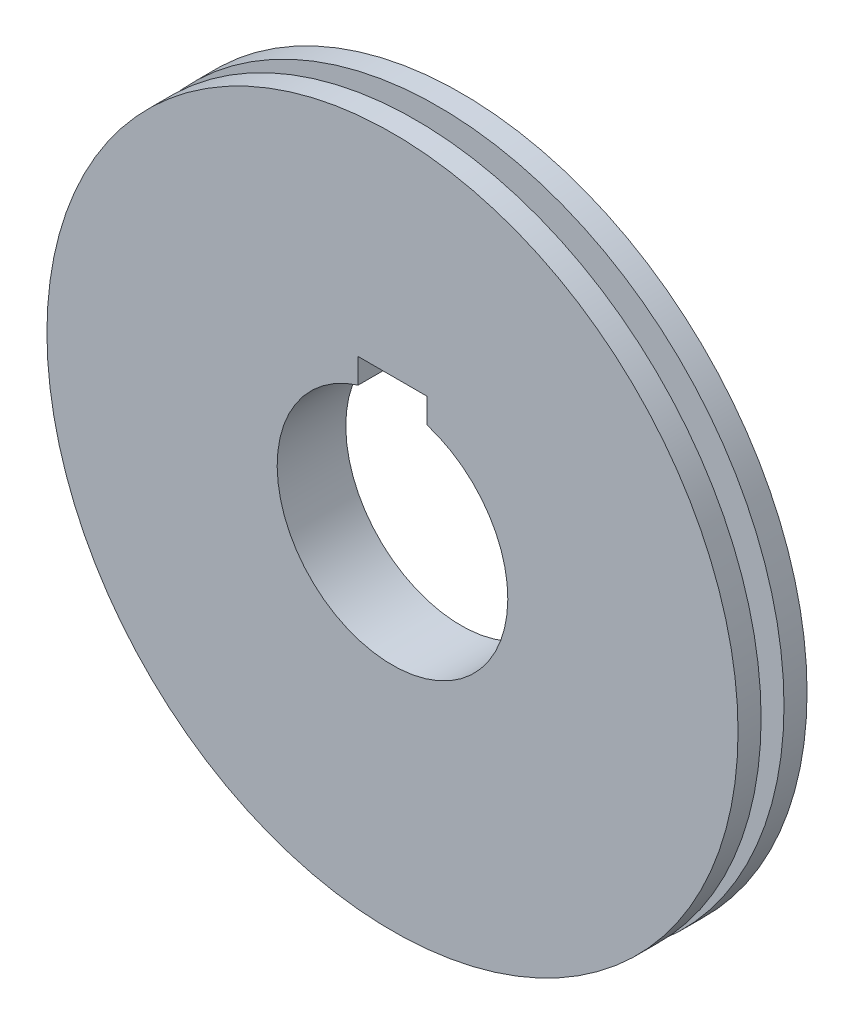
ISO-10303-21;
HEADER;
FILE_DESCRIPTION(('STEP AP214'),'2;1');
FILE_NAME('part.step','',(''),(''),'','','');
FILE_SCHEMA(('AUTOMOTIVE_DESIGN { 1 0 10303 214 1 1 1 1 }'));
ENDSEC;
DATA;
#1=APPLICATION_CONTEXT('core data for automotive mechanical design processes');
#2=APPLICATION_PROTOCOL_DEFINITION('international standard','automotive_design',2000,#1);
#3=PRODUCT_CONTEXT('',#1,'mechanical');
#4=PRODUCT('Part','Part','',(#3));
#5=PRODUCT_RELATED_PRODUCT_CATEGORY('part','',(#4));
#6=PRODUCT_DEFINITION_FORMATION('','',#4);
#7=PRODUCT_DEFINITION_CONTEXT('part definition',#1,'design');
#8=PRODUCT_DEFINITION('design','',#6,#7);
#9=PRODUCT_DEFINITION_SHAPE('','',#8);
#10=(LENGTH_UNIT() NAMED_UNIT(*) SI_UNIT(.MILLI.,.METRE.));
#11=(NAMED_UNIT(*) PLANE_ANGLE_UNIT() SI_UNIT($,.RADIAN.));
#12=(NAMED_UNIT(*) SI_UNIT($,.STERADIAN.) SOLID_ANGLE_UNIT());
#13=UNCERTAINTY_MEASURE_WITH_UNIT(LENGTH_MEASURE(1.E-05),#10,'distance_accuracy_value','');
#14=(GEOMETRIC_REPRESENTATION_CONTEXT(3) GLOBAL_UNCERTAINTY_ASSIGNED_CONTEXT((#13)) GLOBAL_UNIT_ASSIGNED_CONTEXT((#10,
#11,#12)) REPRESENTATION_CONTEXT('',''));
#15=CARTESIAN_POINT('',(0.,0.,0.));
#16=DIRECTION('',(0.,0.,1.));
#17=DIRECTION('',(1.,0.,0.));
#18=AXIS2_PLACEMENT_3D('',#15,#16,#17);
#19=CARTESIAN_POINT('',(0.,0.,4.));
#20=DIRECTION('',(0.,0.,-1.));
#21=DIRECTION('',(-1.,0.,0.));
#22=AXIS2_PLACEMENT_3D('',#19,#20,#21);
#23=CYLINDRICAL_SURFACE('',#22,60.);
#24=CARTESIAN_POINT('',(0.,0.,4.));
#25=DIRECTION('',(0.,0.,1.));
#26=DIRECTION('',(1.,0.,0.));
#27=AXIS2_PLACEMENT_3D('',#24,#25,#26);
#28=CIRCLE('',#27,60.);
#29=CARTESIAN_POINT('',(60.,0.,4.));
#30=VERTEX_POINT('',#29);
#31=EDGE_CURVE('E48',#30,#30,#28,.T.);
#32=ORIENTED_EDGE('',*,*,#31,.F.);
#33=EDGE_LOOP('',(#32));
#34=FACE_BOUND('',#33,.T.);
#35=CARTESIAN_POINT('',(0.,0.,0.));
#36=DIRECTION('',(0.,0.,1.));
#37=DIRECTION('',(1.,0.,0.));
#38=AXIS2_PLACEMENT_3D('',#35,#36,#37);
#39=CIRCLE('',#38,60.);
#40=CARTESIAN_POINT('',(60.,0.,0.));
#41=VERTEX_POINT('',#40);
#42=EDGE_CURVE('E141',#41,#41,#39,.T.);
#43=ORIENTED_EDGE('',*,*,#42,.T.);
#44=EDGE_LOOP('',(#43));
#45=FACE_BOUND('',#44,.T.);
#46=ADVANCED_FACE('F39',(#34,#45),#23,.T.);
#47=CARTESIAN_POINT('',(0.,0.,4.));
#48=DIRECTION('',(0.,0.,1.));
#49=DIRECTION('',(1.,0.,0.));
#50=AXIS2_PLACEMENT_3D('',#47,#48,#49);
#51=PLANE('',#50);
#52=CARTESIAN_POINT('',(0.,0.,4.));
#53=DIRECTION('',(0.,0.,1.));
#54=DIRECTION('',(1.,0.,0.));
#55=AXIS2_PLACEMENT_3D('',#52,#53,#54);
#56=CIRCLE('',#55,48.4680893672534);
#57=CARTESIAN_POINT('',(48.4680893672534,0.,4.));
#58=VERTEX_POINT('',#57);
#59=EDGE_CURVE('E11',#58,#58,#56,.T.);
#60=ORIENTED_EDGE('',*,*,#59,.F.);
#61=EDGE_LOOP('',(#60));
#62=FACE_BOUND('',#61,.T.);
#63=ORIENTED_EDGE('',*,*,#31,.T.);
#64=EDGE_LOOP('',(#63));
#65=FACE_BOUND('',#64,.T.);
#66=ADVANCED_FACE('F164',(#62,#65),#51,.T.);
#67=CARTESIAN_POINT('',(0.,0.,0.));
#68=DIRECTION('',(0.,0.,1.));
#69=DIRECTION('',(1.,0.,0.));
#70=AXIS2_PLACEMENT_3D('',#67,#68,#69);
#71=PLANE('',#70);
#72=DIRECTION('',(-1.,0.,0.));
#73=VECTOR('',#72,1.);
#74=CARTESIAN_POINT('',(0.,23.3944363624591,0.));
#75=LINE('',#74,#73);
#76=CARTESIAN_POINT('',(5.95,23.3944363624591,0.));
#77=VERTEX_POINT('',#76);
#78=CARTESIAN_POINT('',(-5.95,23.3944363624591,0.));
#79=VERTEX_POINT('',#78);
#80=EDGE_CURVE('E90',#77,#79,#75,.T.);
#81=ORIENTED_EDGE('',*,*,#80,.T.);
#82=DIRECTION('',(0.,-1.,0.));
#83=VECTOR('',#82,1.);
#84=CARTESIAN_POINT('',(-5.95,0.,0.));
#85=LINE('',#84,#83);
#86=CARTESIAN_POINT('',(-5.95,19.0944363624591,0.));
#87=VERTEX_POINT('',#86);
#88=EDGE_CURVE('E121',#79,#87,#85,.T.);
#89=ORIENTED_EDGE('',*,*,#88,.T.);
#90=CARTESIAN_POINT('',(0.,0.,0.));
#91=DIRECTION('',(0.,0.,1.));
#92=DIRECTION('',(1.,0.,0.));
#93=AXIS2_PLACEMENT_3D('',#90,#91,#92);
#94=CIRCLE('',#93,20.);
#95=CARTESIAN_POINT('',(5.95,19.0944363624591,0.));
#96=VERTEX_POINT('',#95);
#97=EDGE_CURVE('E42',#87,#96,#94,.T.);
#98=ORIENTED_EDGE('',*,*,#97,.T.);
#99=DIRECTION('',(0.,1.,0.));
#100=VECTOR('',#99,1.);
#101=CARTESIAN_POINT('',(5.95000000000001,0.,0.));
#102=LINE('',#101,#100);
#103=EDGE_CURVE('E112',#96,#77,#102,.T.);
#104=ORIENTED_EDGE('',*,*,#103,.T.);
#105=EDGE_LOOP('',(#81,#89,#98,#104));
#106=FACE_BOUND('',#105,.T.);
#107=ORIENTED_EDGE('',*,*,#42,.F.);
#108=EDGE_LOOP('',(#107));
#109=FACE_BOUND('',#108,.T.);
#110=ADVANCED_FACE('F150',(#106,#109),#71,.F.);
#111=CARTESIAN_POINT('',(0.,0.,-16.9));
#112=DIRECTION('',(0.,0.,1.));
#113=DIRECTION('',(1.,0.,0.));
#114=AXIS2_PLACEMENT_3D('',#111,#112,#113);
#115=CYLINDRICAL_SURFACE('',#114,20.);
#116=ORIENTED_EDGE('',*,*,#97,.F.);
#117=DIRECTION('',(0.,0.,1.));
#118=VECTOR('',#117,1.);
#119=CARTESIAN_POINT('',(-5.95,19.0944363624591,-36.1));
#120=LINE('',#119,#118);
#121=CARTESIAN_POINT('',(-5.95,19.0944363624591,11.9));
#122=VERTEX_POINT('',#121);
#123=EDGE_CURVE('E64',#87,#122,#120,.T.);
#124=ORIENTED_EDGE('',*,*,#123,.T.);
#125=CARTESIAN_POINT('',(0.,0.,11.9));
#126=DIRECTION('',(0.,0.,1.));
#127=DIRECTION('',(1.,0.,0.));
#128=AXIS2_PLACEMENT_3D('',#125,#126,#127);
#129=CIRCLE('',#128,20.);
#130=CARTESIAN_POINT('',(5.95,19.0944363624591,11.9));
#131=VERTEX_POINT('',#130);
#132=EDGE_CURVE('E124',#122,#131,#129,.T.);
#133=ORIENTED_EDGE('',*,*,#132,.T.);
#134=DIRECTION('',(0.,0.,1.));
#135=VECTOR('',#134,1.);
#136=CARTESIAN_POINT('',(5.95,19.0944363624591,-36.1));
#137=LINE('',#136,#135);
#138=EDGE_CURVE('E56',#96,#131,#137,.T.);
#139=ORIENTED_EDGE('',*,*,#138,.F.);
#140=EDGE_LOOP('',(#116,#124,#133,#139));
#141=FACE_BOUND('',#140,.T.);
#142=ADVANCED_FACE('F153',(#141),#115,.F.);
#143=CARTESIAN_POINT('',(0.,0.,7.9));
#144=DIRECTION('',(0.,0.,-1.));
#145=DIRECTION('',(-1.,0.,0.));
#146=AXIS2_PLACEMENT_3D('',#143,#144,#145);
#147=CYLINDRICAL_SURFACE('',#146,48.4680893672534);
#148=CARTESIAN_POINT('',(0.,0.,7.9));
#149=DIRECTION('',(0.,0.,1.));
#150=DIRECTION('',(1.,0.,0.));
#151=AXIS2_PLACEMENT_3D('',#148,#149,#150);
#152=CIRCLE('',#151,48.4680893672534);
#153=CARTESIAN_POINT('',(48.4680893672534,0.,7.9));
#154=VERTEX_POINT('',#153);
#155=EDGE_CURVE('E132',#154,#154,#152,.T.);
#156=ORIENTED_EDGE('',*,*,#155,.F.);
#157=EDGE_LOOP('',(#156));
#158=FACE_BOUND('',#157,.T.);
#159=ORIENTED_EDGE('',*,*,#59,.T.);
#160=EDGE_LOOP('',(#159));
#161=FACE_BOUND('',#160,.T.);
#162=ADVANCED_FACE('F155',(#158,#161),#147,.T.);
#163=CARTESIAN_POINT('',(0.,0.,11.9));
#164=DIRECTION('',(0.,0.,-1.));
#165=DIRECTION('',(-1.,0.,0.));
#166=AXIS2_PLACEMENT_3D('',#163,#164,#165);
#167=CYLINDRICAL_SURFACE('',#166,59.9299435689343);
#168=CARTESIAN_POINT('',(0.,0.,11.9));
#169=DIRECTION('',(0.,0.,1.));
#170=DIRECTION('',(1.,0.,0.));
#171=AXIS2_PLACEMENT_3D('',#168,#169,#170);
#172=CIRCLE('',#171,59.9299435689343);
#173=CARTESIAN_POINT('',(59.9299435689343,0.,11.9));
#174=VERTEX_POINT('',#173);
#175=EDGE_CURVE('E128',#174,#174,#172,.T.);
#176=ORIENTED_EDGE('',*,*,#175,.F.);
#177=EDGE_LOOP('',(#176));
#178=FACE_BOUND('',#177,.T.);
#179=CARTESIAN_POINT('',(0.,0.,7.9));
#180=DIRECTION('',(0.,0.,1.));
#181=DIRECTION('',(1.,0.,0.));
#182=AXIS2_PLACEMENT_3D('',#179,#180,#181);
#183=CIRCLE('',#182,59.9299435689343);
#184=CARTESIAN_POINT('',(59.9299435689343,0.,7.9));
#185=VERTEX_POINT('',#184);
#186=EDGE_CURVE('E127',#185,#185,#183,.T.);
#187=ORIENTED_EDGE('',*,*,#186,.T.);
#188=EDGE_LOOP('',(#187));
#189=FACE_BOUND('',#188,.T.);
#190=ADVANCED_FACE('F161',(#178,#189),#167,.T.);
#191=CARTESIAN_POINT('',(0.,0.,11.9));
#192=DIRECTION('',(0.,0.,1.));
#193=DIRECTION('',(1.,0.,0.));
#194=AXIS2_PLACEMENT_3D('',#191,#192,#193);
#195=PLANE('',#194);
#196=DIRECTION('',(0.,-1.,0.));
#197=VECTOR('',#196,1.);
#198=CARTESIAN_POINT('',(-5.95,19.0944363624591,11.9));
#199=LINE('',#198,#197);
#200=CARTESIAN_POINT('',(-5.95,23.3944363624591,11.9));
#201=VERTEX_POINT('',#200);
#202=EDGE_CURVE('E104',#201,#122,#199,.T.);
#203=ORIENTED_EDGE('',*,*,#202,.F.);
#204=DIRECTION('',(-1.,0.,0.));
#205=VECTOR('',#204,1.);
#206=CARTESIAN_POINT('',(-5.95,23.3944363624591,11.9));
#207=LINE('',#206,#205);
#208=CARTESIAN_POINT('',(5.95,23.3944363624591,11.9));
#209=VERTEX_POINT('',#208);
#210=EDGE_CURVE('E87',#209,#201,#207,.T.);
#211=ORIENTED_EDGE('',*,*,#210,.F.);
#212=DIRECTION('',(0.,1.,0.));
#213=VECTOR('',#212,1.);
#214=CARTESIAN_POINT('',(5.95,23.3944363624591,11.9));
#215=LINE('',#214,#213);
#216=EDGE_CURVE('E95',#131,#209,#215,.T.);
#217=ORIENTED_EDGE('',*,*,#216,.F.);
#218=ORIENTED_EDGE('',*,*,#132,.F.);
#219=EDGE_LOOP('',(#203,#211,#217,#218));
#220=FACE_BOUND('',#219,.T.);
#221=ORIENTED_EDGE('',*,*,#175,.T.);
#222=EDGE_LOOP('',(#221));
#223=FACE_BOUND('',#222,.T.);
#224=ADVANCED_FACE('F102',(#220,#223),#195,.T.);
#225=CARTESIAN_POINT('',(0.,0.,7.9));
#226=DIRECTION('',(0.,0.,1.));
#227=DIRECTION('',(1.,0.,0.));
#228=AXIS2_PLACEMENT_3D('',#225,#226,#227);
#229=PLANE('',#228);
#230=ORIENTED_EDGE('',*,*,#155,.T.);
#231=EDGE_LOOP('',(#230));
#232=FACE_BOUND('',#231,.T.);
#233=ORIENTED_EDGE('',*,*,#186,.F.);
#234=EDGE_LOOP('',(#233));
#235=FACE_BOUND('',#234,.T.);
#236=ADVANCED_FACE('F189',(#232,#235),#229,.F.);
#237=CARTESIAN_POINT('',(-5.95,19.0944363624591,-36.1));
#238=DIRECTION('',(-1.,0.,0.));
#239=DIRECTION('',(0.,0.,1.));
#240=AXIS2_PLACEMENT_3D('',#237,#238,#239);
#241=PLANE('',#240);
#242=DIRECTION('',(0.,0.,1.));
#243=VECTOR('',#242,1.);
#244=CARTESIAN_POINT('',(-5.95,23.3944363624591,-36.1));
#245=LINE('',#244,#243);
#246=EDGE_CURVE('E93',#79,#201,#245,.T.);
#247=ORIENTED_EDGE('',*,*,#246,.T.);
#248=ORIENTED_EDGE('',*,*,#202,.T.);
#249=ORIENTED_EDGE('',*,*,#123,.F.);
#250=ORIENTED_EDGE('',*,*,#88,.F.);
#251=EDGE_LOOP('',(#247,#248,#249,#250));
#252=FACE_BOUND('',#251,.T.);
#253=ADVANCED_FACE('F210',(#252),#241,.F.);
#254=CARTESIAN_POINT('',(-5.95,23.3944363624591,-36.1));
#255=DIRECTION('',(0.,1.,0.));
#256=DIRECTION('',(0.,0.,1.));
#257=AXIS2_PLACEMENT_3D('',#254,#255,#256);
#258=PLANE('',#257);
#259=DIRECTION('',(0.,0.,1.));
#260=VECTOR('',#259,1.);
#261=CARTESIAN_POINT('',(5.95,23.3944363624591,-36.1));
#262=LINE('',#261,#260);
#263=EDGE_CURVE('E83',#77,#209,#262,.T.);
#264=ORIENTED_EDGE('',*,*,#263,.T.);
#265=ORIENTED_EDGE('',*,*,#210,.T.);
#266=ORIENTED_EDGE('',*,*,#246,.F.);
#267=ORIENTED_EDGE('',*,*,#80,.F.);
#268=EDGE_LOOP('',(#264,#265,#266,#267));
#269=FACE_BOUND('',#268,.T.);
#270=ADVANCED_FACE('F84',(#269),#258,.F.);
#271=CARTESIAN_POINT('',(5.95,23.3944363624591,-36.1));
#272=DIRECTION('',(1.,0.,0.));
#273=DIRECTION('',(0.,1.,0.));
#274=AXIS2_PLACEMENT_3D('',#271,#272,#273);
#275=PLANE('',#274);
#276=ORIENTED_EDGE('',*,*,#138,.T.);
#277=ORIENTED_EDGE('',*,*,#216,.T.);
#278=ORIENTED_EDGE('',*,*,#263,.F.);
#279=ORIENTED_EDGE('',*,*,#103,.F.);
#280=EDGE_LOOP('',(#276,#277,#278,#279));
#281=FACE_BOUND('',#280,.T.);
#282=ADVANCED_FACE('F96',(#281),#275,.F.);
#283=CLOSED_SHELL('',(#46,#66,#110,#142,#162,#190,#224,#236,#253,#270,#282));
#284=MANIFOLD_SOLID_BREP('B2',#283);
#285=ADVANCED_BREP_SHAPE_REPRESENTATION('',(#18,#284),#14);
#286=SHAPE_DEFINITION_REPRESENTATION(#9,#285);
ENDSEC;
END-ISO-10303-21;
